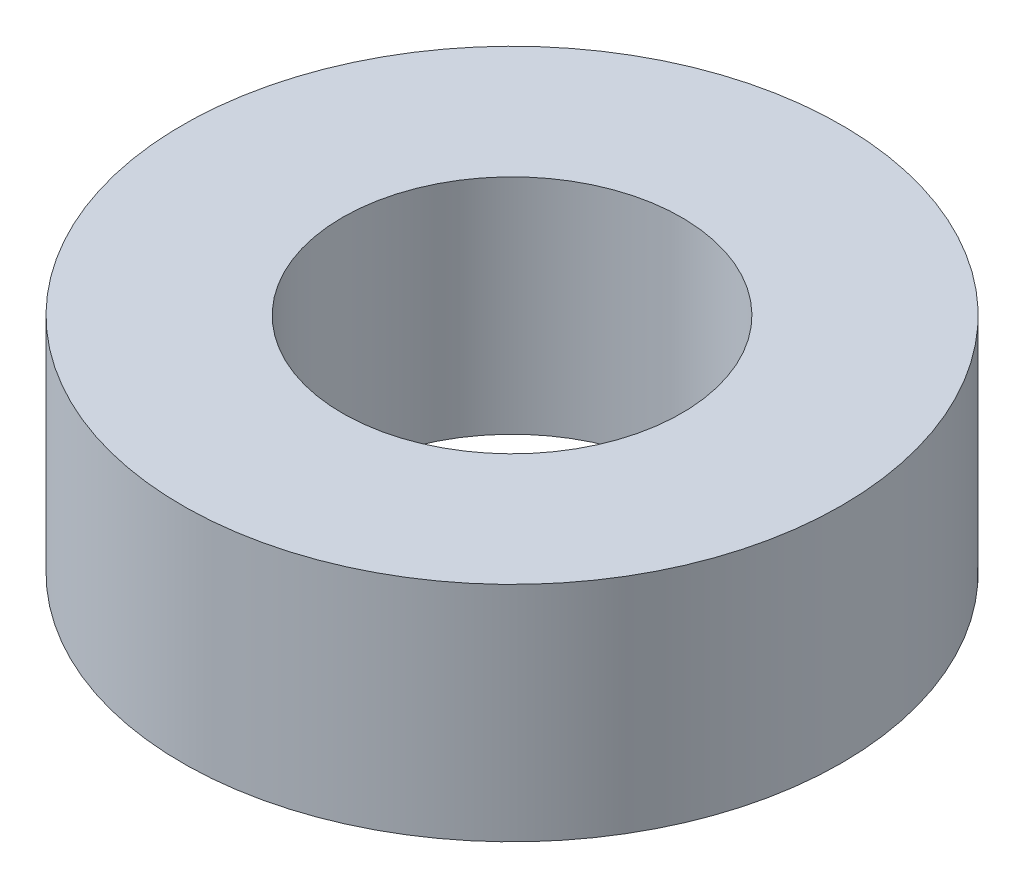
ISO-10303-21;
HEADER;
FILE_DESCRIPTION(('STEP AP214'),'2;1');
FILE_NAME('part.step','',(''),(''),'','','');
FILE_SCHEMA(('AUTOMOTIVE_DESIGN { 1 0 10303 214 1 1 1 1 }'));
ENDSEC;
DATA;
#1=APPLICATION_CONTEXT('core data for automotive mechanical design processes');
#2=APPLICATION_PROTOCOL_DEFINITION('international standard','automotive_design',2000,#1);
#3=PRODUCT_CONTEXT('',#1,'mechanical');
#4=PRODUCT('Part','Part','',(#3));
#5=PRODUCT_RELATED_PRODUCT_CATEGORY('part','',(#4));
#6=PRODUCT_DEFINITION_FORMATION('','',#4);
#7=PRODUCT_DEFINITION_CONTEXT('part definition',#1,'design');
#8=PRODUCT_DEFINITION('design','',#6,#7);
#9=PRODUCT_DEFINITION_SHAPE('','',#8);
#10=(LENGTH_UNIT() NAMED_UNIT(*) SI_UNIT(.MILLI.,.METRE.));
#11=(NAMED_UNIT(*) PLANE_ANGLE_UNIT() SI_UNIT($,.RADIAN.));
#12=(NAMED_UNIT(*) SI_UNIT($,.STERADIAN.) SOLID_ANGLE_UNIT());
#13=UNCERTAINTY_MEASURE_WITH_UNIT(LENGTH_MEASURE(1.E-05),#10,'distance_accuracy_value','');
#14=(GEOMETRIC_REPRESENTATION_CONTEXT(3) GLOBAL_UNCERTAINTY_ASSIGNED_CONTEXT((#13)) GLOBAL_UNIT_ASSIGNED_CONTEXT((#10,
#11,#12)) REPRESENTATION_CONTEXT('',''));
#15=CARTESIAN_POINT('',(0.,0.,0.));
#16=DIRECTION('',(0.,0.,1.));
#17=DIRECTION('',(1.,0.,0.));
#18=AXIS2_PLACEMENT_3D('',#15,#16,#17);
#19=CARTESIAN_POINT('',(-12.0000001788138,-7.24966050013479,21.0000003129244));
#20=DIRECTION('',(0.,1.,0.));
#21=DIRECTION('',(-1.,0.,0.));
#22=AXIS2_PLACEMENT_3D('',#19,#20,#21);
#23=CYLINDRICAL_SURFACE('',#22,1.75);
#24=CARTESIAN_POINT('',(-12.0000001788138,-6.37466050013479,21.0000003129244));
#25=DIRECTION('',(0.,1.,0.));
#26=DIRECTION('',(-1.,0.,0.));
#27=AXIS2_PLACEMENT_3D('',#24,#25,#26);
#28=CIRCLE('',#27,1.75);
#29=CARTESIAN_POINT('',(-13.7500001788138,-6.37466050013483,21.0000003129244));
#30=VERTEX_POINT('',#29);
#31=EDGE_CURVE('E27',#30,#30,#28,.F.);
#32=ORIENTED_EDGE('',*,*,#31,.F.);
#33=EDGE_LOOP('',(#32));
#34=FACE_BOUND('',#33,.T.);
#35=CARTESIAN_POINT('',(-12.0000001788138,-8.67466050013479,21.0000003129244));
#36=DIRECTION('',(0.,1.,0.));
#37=DIRECTION('',(-1.,0.,0.));
#38=AXIS2_PLACEMENT_3D('',#35,#36,#37);
#39=CIRCLE('',#38,1.75);
#40=CARTESIAN_POINT('',(-13.7500001788138,-8.67466050013483,21.0000003129244));
#41=VERTEX_POINT('',#40);
#42=EDGE_CURVE('E18',#41,#41,#39,.T.);
#43=ORIENTED_EDGE('',*,*,#42,.F.);
#44=EDGE_LOOP('',(#43));
#45=FACE_BOUND('',#44,.T.);
#46=ADVANCED_FACE('F15',(#34,#45),#23,.F.);
#47=CARTESIAN_POINT('',(-12.0000001788137,-8.67466050013479,21.0000003129244));
#48=DIRECTION('',(0.,-1.,0.));
#49=DIRECTION('',(1.,0.,0.));
#50=AXIS2_PLACEMENT_3D('',#47,#48,#49);
#51=PLANE('',#50);
#52=ORIENTED_EDGE('',*,*,#42,.T.);
#53=EDGE_LOOP('',(#52));
#54=FACE_BOUND('',#53,.T.);
#55=CARTESIAN_POINT('',(-12.0000001788138,-8.67466050013479,21.0000003129244));
#56=DIRECTION('',(0.,-1.,0.));
#57=DIRECTION('',(1.,0.,0.));
#58=AXIS2_PLACEMENT_3D('',#55,#56,#57);
#59=CIRCLE('',#58,3.4);
#60=CARTESIAN_POINT('',(-8.60000017881377,-8.67466050013472,21.0000003129244));
#61=VERTEX_POINT('',#60);
#62=EDGE_CURVE('E22',#61,#61,#59,.F.);
#63=ORIENTED_EDGE('',*,*,#62,.F.);
#64=EDGE_LOOP('',(#63));
#65=FACE_BOUND('',#64,.T.);
#66=ADVANCED_FACE('F35',(#54,#65),#51,.T.);
#67=CARTESIAN_POINT('',(-12.0000001788138,-6.37466050013479,21.0000003129244));
#68=DIRECTION('',(0.,1.,0.));
#69=DIRECTION('',(-1.,0.,0.));
#70=AXIS2_PLACEMENT_3D('',#67,#68,#69);
#71=PLANE('',#70);
#72=ORIENTED_EDGE('',*,*,#31,.T.);
#73=EDGE_LOOP('',(#72));
#74=FACE_BOUND('',#73,.T.);
#75=CARTESIAN_POINT('',(-12.0000001788138,-6.37466050013479,21.0000003129244));
#76=DIRECTION('',(0.,-1.,0.));
#77=DIRECTION('',(1.,0.,0.));
#78=AXIS2_PLACEMENT_3D('',#75,#76,#77);
#79=CIRCLE('',#78,3.4);
#80=CARTESIAN_POINT('',(-8.60000017881382,-6.37466050013472,21.0000003129244));
#81=VERTEX_POINT('',#80);
#82=EDGE_CURVE('E10',#81,#81,#79,.T.);
#83=ORIENTED_EDGE('',*,*,#82,.F.);
#84=EDGE_LOOP('',(#83));
#85=FACE_BOUND('',#84,.T.);
#86=ADVANCED_FACE('F44',(#74,#85),#71,.T.);
#87=CARTESIAN_POINT('',(-12.0000001788138,-7.24966050013479,21.0000003129244));
#88=DIRECTION('',(0.,-1.,0.));
#89=DIRECTION('',(1.,0.,0.));
#90=AXIS2_PLACEMENT_3D('',#87,#88,#89);
#91=CYLINDRICAL_SURFACE('',#90,3.4);
#92=ORIENTED_EDGE('',*,*,#82,.T.);
#93=EDGE_LOOP('',(#92));
#94=FACE_BOUND('',#93,.T.);
#95=ORIENTED_EDGE('',*,*,#62,.T.);
#96=EDGE_LOOP('',(#95));
#97=FACE_BOUND('',#96,.T.);
#98=ADVANCED_FACE('F45',(#94,#97),#91,.T.);
#99=CLOSED_SHELL('',(#46,#66,#86,#98));
#100=MANIFOLD_SOLID_BREP('B1',#99);
#101=ADVANCED_BREP_SHAPE_REPRESENTATION('',(#18,#100),#14);
#102=SHAPE_DEFINITION_REPRESENTATION(#9,#101);
ENDSEC;
END-ISO-10303-21;
